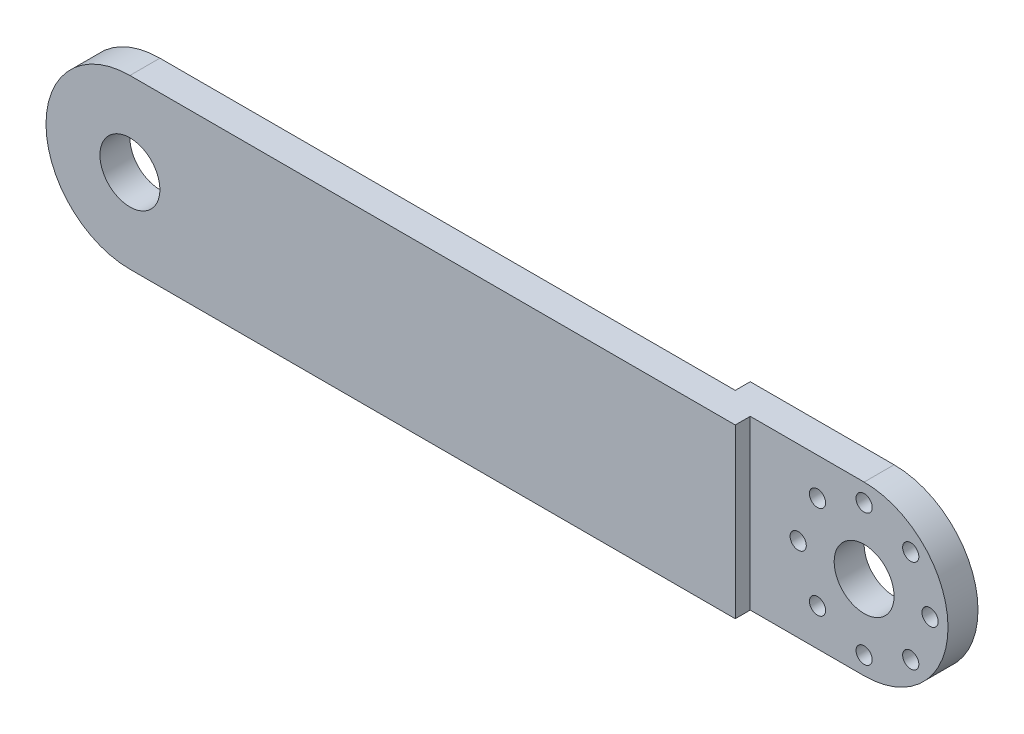
ISO-10303-21;
HEADER;
FILE_DESCRIPTION(('STEP AP214'),'2;1');
FILE_NAME('part.step','',(''),(''),'','','');
FILE_SCHEMA(('AUTOMOTIVE_DESIGN { 1 0 10303 214 1 1 1 1 }'));
ENDSEC;
DATA;
#1=APPLICATION_CONTEXT('core data for automotive mechanical design processes');
#2=APPLICATION_PROTOCOL_DEFINITION('international standard','automotive_design',2000,#1);
#3=PRODUCT_CONTEXT('',#1,'mechanical');
#4=PRODUCT('Part','Part','',(#3));
#5=PRODUCT_RELATED_PRODUCT_CATEGORY('part','',(#4));
#6=PRODUCT_DEFINITION_FORMATION('','',#4);
#7=PRODUCT_DEFINITION_CONTEXT('part definition',#1,'design');
#8=PRODUCT_DEFINITION('design','',#6,#7);
#9=PRODUCT_DEFINITION_SHAPE('','',#8);
#10=(LENGTH_UNIT() NAMED_UNIT(*) SI_UNIT(.MILLI.,.METRE.));
#11=(NAMED_UNIT(*) PLANE_ANGLE_UNIT() SI_UNIT($,.RADIAN.));
#12=(NAMED_UNIT(*) SI_UNIT($,.STERADIAN.) SOLID_ANGLE_UNIT());
#13=UNCERTAINTY_MEASURE_WITH_UNIT(LENGTH_MEASURE(1.E-05),#10,'distance_accuracy_value','');
#14=(GEOMETRIC_REPRESENTATION_CONTEXT(3) GLOBAL_UNCERTAINTY_ASSIGNED_CONTEXT((#13)) GLOBAL_UNIT_ASSIGNED_CONTEXT((#10,
#11,#12)) REPRESENTATION_CONTEXT('',''));
#15=CARTESIAN_POINT('',(0.,0.,0.));
#16=DIRECTION('',(0.,0.,1.));
#17=DIRECTION('',(1.,0.,0.));
#18=AXIS2_PLACEMENT_3D('',#15,#16,#17);
#19=CARTESIAN_POINT('',(0.,-14.,5.));
#20=DIRECTION('',(0.,1.,0.));
#21=DIRECTION('',(0.,0.,1.));
#22=AXIS2_PLACEMENT_3D('',#19,#20,#21);
#23=PLANE('',#22);
#24=DIRECTION('',(1.,0.,0.));
#25=VECTOR('',#24,1.);
#26=CARTESIAN_POINT('',(0.,-14.,0.));
#27=LINE('',#26,#25);
#28=CARTESIAN_POINT('',(0.,-14.,0.));
#29=VERTEX_POINT('',#28);
#30=CARTESIAN_POINT('',(96.,-14.,0.));
#31=VERTEX_POINT('',#30);
#32=EDGE_CURVE('E70',#29,#31,#27,.T.);
#33=ORIENTED_EDGE('',*,*,#32,.T.);
#34=DIRECTION('',(0.,0.,-1.));
#35=VECTOR('',#34,1.);
#36=CARTESIAN_POINT('',(96.,-14.,-2.5));
#37=LINE('',#36,#35);
#38=CARTESIAN_POINT('',(96.,-14.,-2.5));
#39=VERTEX_POINT('',#38);
#40=EDGE_CURVE('E94',#31,#39,#37,.T.);
#41=ORIENTED_EDGE('',*,*,#40,.T.);
#42=DIRECTION('',(-1.,0.,0.));
#43=VECTOR('',#42,1.);
#44=CARTESIAN_POINT('',(101.,-14.,-2.5));
#45=LINE('',#44,#43);
#46=CARTESIAN_POINT('',(120.,-14.,-2.5));
#47=VERTEX_POINT('',#46);
#48=EDGE_CURVE('E91',#47,#39,#45,.T.);
#49=ORIENTED_EDGE('',*,*,#48,.F.);
#50=DIRECTION('',(0.,0.,-1.));
#51=VECTOR('',#50,1.);
#52=CARTESIAN_POINT('',(120.,-14.,2.5));
#53=LINE('',#52,#51);
#54=CARTESIAN_POINT('',(120.,-14.,2.5));
#55=VERTEX_POINT('',#54);
#56=EDGE_CURVE('E79',#55,#47,#53,.T.);
#57=ORIENTED_EDGE('',*,*,#56,.F.);
#58=DIRECTION('',(-1.,0.,0.));
#59=VECTOR('',#58,1.);
#60=CARTESIAN_POINT('',(106.,-14.,2.5));
#61=LINE('',#60,#59);
#62=CARTESIAN_POINT('',(101.,-14.,2.5));
#63=VERTEX_POINT('',#62);
#64=EDGE_CURVE('E120',#55,#63,#61,.T.);
#65=ORIENTED_EDGE('',*,*,#64,.T.);
#66=DIRECTION('',(0.,0.,1.));
#67=VECTOR('',#66,1.);
#68=CARTESIAN_POINT('',(101.,-14.,2.5));
#69=LINE('',#68,#67);
#70=CARTESIAN_POINT('',(101.,-14.,5.));
#71=VERTEX_POINT('',#70);
#72=EDGE_CURVE('E265',#63,#71,#69,.T.);
#73=ORIENTED_EDGE('',*,*,#72,.T.);
#74=DIRECTION('',(1.,0.,0.));
#75=VECTOR('',#74,1.);
#76=CARTESIAN_POINT('',(0.,-14.,5.));
#77=LINE('',#76,#75);
#78=CARTESIAN_POINT('',(0.,-14.,5.));
#79=VERTEX_POINT('',#78);
#80=EDGE_CURVE('E134',#79,#71,#77,.T.);
#81=ORIENTED_EDGE('',*,*,#80,.F.);
#82=DIRECTION('',(0.,0.,-1.));
#83=VECTOR('',#82,1.);
#84=CARTESIAN_POINT('',(0.,-14.,5.));
#85=LINE('',#84,#83);
#86=EDGE_CURVE('E11',#79,#29,#85,.T.);
#87=ORIENTED_EDGE('',*,*,#86,.T.);
#88=EDGE_LOOP('',(#33,#41,#49,#57,#65,#73,#81,#87));
#89=FACE_BOUND('',#88,.T.);
#90=ADVANCED_FACE('F39',(#89),#23,.F.);
#91=CARTESIAN_POINT('',(0.,14.,5.));
#92=DIRECTION('',(0.,-1.,0.));
#93=DIRECTION('',(0.,0.,-1.));
#94=AXIS2_PLACEMENT_3D('',#91,#92,#93);
#95=PLANE('',#94);
#96=DIRECTION('',(0.,0.,-1.));
#97=VECTOR('',#96,1.);
#98=CARTESIAN_POINT('',(96.,14.,-2.5));
#99=LINE('',#98,#97);
#100=CARTESIAN_POINT('',(96.,14.,0.));
#101=VERTEX_POINT('',#100);
#102=CARTESIAN_POINT('',(96.,14.,-2.5));
#103=VERTEX_POINT('',#102);
#104=EDGE_CURVE('E312',#101,#103,#99,.T.);
#105=ORIENTED_EDGE('',*,*,#104,.F.);
#106=DIRECTION('',(-1.,0.,0.));
#107=VECTOR('',#106,1.);
#108=CARTESIAN_POINT('',(0.,14.,0.));
#109=LINE('',#108,#107);
#110=CARTESIAN_POINT('',(0.,14.,0.));
#111=VERTEX_POINT('',#110);
#112=EDGE_CURVE('E135',#101,#111,#109,.T.);
#113=ORIENTED_EDGE('',*,*,#112,.T.);
#114=DIRECTION('',(0.,0.,-1.));
#115=VECTOR('',#114,1.);
#116=CARTESIAN_POINT('',(0.,14.,5.));
#117=LINE('',#116,#115);
#118=CARTESIAN_POINT('',(0.,14.,5.));
#119=VERTEX_POINT('',#118);
#120=EDGE_CURVE('E49',#119,#111,#117,.T.);
#121=ORIENTED_EDGE('',*,*,#120,.F.);
#122=DIRECTION('',(-1.,0.,0.));
#123=VECTOR('',#122,1.);
#124=CARTESIAN_POINT('',(0.,14.,5.));
#125=LINE('',#124,#123);
#126=CARTESIAN_POINT('',(101.,14.,5.));
#127=VERTEX_POINT('',#126);
#128=EDGE_CURVE('E58',#127,#119,#125,.T.);
#129=ORIENTED_EDGE('',*,*,#128,.F.);
#130=DIRECTION('',(0.,0.,1.));
#131=VECTOR('',#130,1.);
#132=CARTESIAN_POINT('',(101.,14.,2.5));
#133=LINE('',#132,#131);
#134=CARTESIAN_POINT('',(101.,14.,2.5));
#135=VERTEX_POINT('',#134);
#136=EDGE_CURVE('E263',#135,#127,#133,.T.);
#137=ORIENTED_EDGE('',*,*,#136,.F.);
#138=DIRECTION('',(1.,0.,0.));
#139=VECTOR('',#138,1.);
#140=CARTESIAN_POINT('',(106.,14.,2.5));
#141=LINE('',#140,#139);
#142=CARTESIAN_POINT('',(120.,14.,2.5));
#143=VERTEX_POINT('',#142);
#144=EDGE_CURVE('E113',#135,#143,#141,.T.);
#145=ORIENTED_EDGE('',*,*,#144,.T.);
#146=DIRECTION('',(0.,0.,-1.));
#147=VECTOR('',#146,1.);
#148=CARTESIAN_POINT('',(120.,14.,2.5));
#149=LINE('',#148,#147);
#150=CARTESIAN_POINT('',(120.,14.,-2.5));
#151=VERTEX_POINT('',#150);
#152=EDGE_CURVE('E108',#143,#151,#149,.T.);
#153=ORIENTED_EDGE('',*,*,#152,.T.);
#154=DIRECTION('',(1.,0.,0.));
#155=VECTOR('',#154,1.);
#156=CARTESIAN_POINT('',(106.,14.,-2.5));
#157=LINE('',#156,#155);
#158=EDGE_CURVE('E99',#103,#151,#157,.T.);
#159=ORIENTED_EDGE('',*,*,#158,.F.);
#160=EDGE_LOOP('',(#105,#113,#121,#129,#137,#145,#153,#159));
#161=FACE_BOUND('',#160,.T.);
#162=ADVANCED_FACE('F191',(#161),#95,.F.);
#163=CARTESIAN_POINT('',(0.,0.,5.));
#164=DIRECTION('',(0.,0.,1.));
#165=DIRECTION('',(1.,0.,0.));
#166=AXIS2_PLACEMENT_3D('',#163,#164,#165);
#167=PLANE('',#166);
#168=CARTESIAN_POINT('',(0.,0.,5.));
#169=DIRECTION('',(0.,0.,-1.));
#170=DIRECTION('',(-1.,0.,0.));
#171=AXIS2_PLACEMENT_3D('',#168,#169,#170);
#172=CIRCLE('',#171,5.);
#173=CARTESIAN_POINT('',(-5.,0.,5.));
#174=VERTEX_POINT('',#173);
#175=EDGE_CURVE('E126',#174,#174,#172,.T.);
#176=ORIENTED_EDGE('',*,*,#175,.T.);
#177=EDGE_LOOP('',(#176));
#178=FACE_BOUND('',#177,.T.);
#179=ORIENTED_EDGE('',*,*,#80,.T.);
#180=DIRECTION('',(0.,-1.,0.));
#181=VECTOR('',#180,1.);
#182=CARTESIAN_POINT('',(101.,14.,5.));
#183=LINE('',#182,#181);
#184=EDGE_CURVE('E267',#127,#71,#183,.T.);
#185=ORIENTED_EDGE('',*,*,#184,.F.);
#186=ORIENTED_EDGE('',*,*,#128,.T.);
#187=CARTESIAN_POINT('',(0.,0.,5.));
#188=DIRECTION('',(0.,0.,1.));
#189=DIRECTION('',(1.,0.,0.));
#190=AXIS2_PLACEMENT_3D('',#187,#188,#189);
#191=CIRCLE('',#190,14.);
#192=EDGE_CURVE('E132',#119,#79,#191,.T.);
#193=ORIENTED_EDGE('',*,*,#192,.T.);
#194=EDGE_LOOP('',(#179,#185,#186,#193));
#195=FACE_BOUND('',#194,.T.);
#196=ADVANCED_FACE('F196',(#178,#195),#167,.T.);
#197=CARTESIAN_POINT('',(0.,0.,0.));
#198=DIRECTION('',(0.,0.,1.));
#199=DIRECTION('',(1.,0.,0.));
#200=AXIS2_PLACEMENT_3D('',#197,#198,#199);
#201=PLANE('',#200);
#202=CARTESIAN_POINT('',(0.,0.,0.));
#203=DIRECTION('',(0.,0.,-1.));
#204=DIRECTION('',(-1.,0.,0.));
#205=AXIS2_PLACEMENT_3D('',#202,#203,#204);
#206=CIRCLE('',#205,5.);
#207=CARTESIAN_POINT('',(-5.,0.,0.));
#208=VERTEX_POINT('',#207);
#209=EDGE_CURVE('E125',#208,#208,#206,.T.);
#210=ORIENTED_EDGE('',*,*,#209,.F.);
#211=EDGE_LOOP('',(#210));
#212=FACE_BOUND('',#211,.T.);
#213=ORIENTED_EDGE('',*,*,#112,.F.);
#214=DIRECTION('',(0.,-1.,0.));
#215=VECTOR('',#214,1.);
#216=CARTESIAN_POINT('',(96.,14.,0.));
#217=LINE('',#216,#215);
#218=EDGE_CURVE('E275',#101,#31,#217,.T.);
#219=ORIENTED_EDGE('',*,*,#218,.T.);
#220=ORIENTED_EDGE('',*,*,#32,.F.);
#221=CARTESIAN_POINT('',(0.,0.,0.));
#222=DIRECTION('',(0.,0.,1.));
#223=DIRECTION('',(1.,0.,0.));
#224=AXIS2_PLACEMENT_3D('',#221,#222,#223);
#225=CIRCLE('',#224,14.);
#226=EDGE_CURVE('E129',#111,#29,#225,.T.);
#227=ORIENTED_EDGE('',*,*,#226,.F.);
#228=EDGE_LOOP('',(#213,#219,#220,#227));
#229=FACE_BOUND('',#228,.T.);
#230=ADVANCED_FACE('F200',(#212,#229),#201,.F.);
#231=CARTESIAN_POINT('',(0.,0.,5.));
#232=DIRECTION('',(0.,0.,-1.));
#233=DIRECTION('',(-1.,0.,0.));
#234=AXIS2_PLACEMENT_3D('',#231,#232,#233);
#235=CYLINDRICAL_SURFACE('',#234,14.);
#236=ORIENTED_EDGE('',*,*,#226,.T.);
#237=ORIENTED_EDGE('',*,*,#86,.F.);
#238=ORIENTED_EDGE('',*,*,#192,.F.);
#239=ORIENTED_EDGE('',*,*,#120,.T.);
#240=EDGE_LOOP('',(#236,#237,#238,#239));
#241=FACE_BOUND('',#240,.T.);
#242=ADVANCED_FACE('F41',(#241),#235,.T.);
#243=CARTESIAN_POINT('',(0.,0.,5.));
#244=DIRECTION('',(0.,0.,-1.));
#245=DIRECTION('',(-1.,0.,0.));
#246=AXIS2_PLACEMENT_3D('',#243,#244,#245);
#247=CYLINDRICAL_SURFACE('',#246,5.);
#248=ORIENTED_EDGE('',*,*,#175,.F.);
#249=EDGE_LOOP('',(#248));
#250=FACE_BOUND('',#249,.T.);
#251=ORIENTED_EDGE('',*,*,#209,.T.);
#252=EDGE_LOOP('',(#251));
#253=FACE_BOUND('',#252,.T.);
#254=ADVANCED_FACE('F207',(#250,#253),#247,.F.);
#255=CARTESIAN_POINT('',(0.,0.,-2.5));
#256=DIRECTION('',(0.,0.,1.));
#257=DIRECTION('',(1.,0.,0.));
#258=AXIS2_PLACEMENT_3D('',#255,#256,#257);
#259=PLANE('',#258);
#260=CARTESIAN_POINT('',(131.,0.,-2.5));
#261=DIRECTION('',(0.,0.,-1.));
#262=DIRECTION('',(-1.,0.,0.));
#263=AXIS2_PLACEMENT_3D('',#260,#261,#262);
#264=CIRCLE('',#263,1.34999999999998);
#265=CARTESIAN_POINT('',(129.65,0.,-2.5));
#266=VERTEX_POINT('',#265);
#267=EDGE_CURVE('E281',#266,#266,#264,.T.);
#268=ORIENTED_EDGE('',*,*,#267,.F.);
#269=EDGE_LOOP('',(#268));
#270=FACE_BOUND('',#269,.T.);
#271=CARTESIAN_POINT('',(120.,-11.,-2.5));
#272=DIRECTION('',(0.,0.,-1.));
#273=DIRECTION('',(-1.,0.,0.));
#274=AXIS2_PLACEMENT_3D('',#271,#272,#273);
#275=CIRCLE('',#274,1.35000000000001);
#276=CARTESIAN_POINT('',(118.65,-11.,-2.5));
#277=VERTEX_POINT('',#276);
#278=EDGE_CURVE('E290',#277,#277,#275,.T.);
#279=ORIENTED_EDGE('',*,*,#278,.F.);
#280=EDGE_LOOP('',(#279));
#281=FACE_BOUND('',#280,.T.);
#282=CARTESIAN_POINT('',(109.,0.,-2.5));
#283=DIRECTION('',(0.,0.,-1.));
#284=DIRECTION('',(-1.,0.,0.));
#285=AXIS2_PLACEMENT_3D('',#282,#283,#284);
#286=CIRCLE('',#285,1.35000000000001);
#287=CARTESIAN_POINT('',(107.65,0.,-2.5));
#288=VERTEX_POINT('',#287);
#289=EDGE_CURVE('E292',#288,#288,#286,.T.);
#290=ORIENTED_EDGE('',*,*,#289,.F.);
#291=EDGE_LOOP('',(#290));
#292=FACE_BOUND('',#291,.T.);
#293=CARTESIAN_POINT('',(120.,11.,-2.5));
#294=DIRECTION('',(0.,0.,-1.));
#295=DIRECTION('',(-1.,0.,0.));
#296=AXIS2_PLACEMENT_3D('',#293,#294,#295);
#297=CIRCLE('',#296,1.35000000000001);
#298=CARTESIAN_POINT('',(118.65,11.,-2.5));
#299=VERTEX_POINT('',#298);
#300=EDGE_CURVE('E236',#299,#299,#297,.T.);
#301=ORIENTED_EDGE('',*,*,#300,.F.);
#302=EDGE_LOOP('',(#301));
#303=FACE_BOUND('',#302,.T.);
#304=CARTESIAN_POINT('',(112.221825406948,7.77817459305201,-2.5));
#305=DIRECTION('',(0.,0.,-1.));
#306=DIRECTION('',(-1.,0.,0.));
#307=AXIS2_PLACEMENT_3D('',#304,#305,#306);
#308=CIRCLE('',#307,1.35000000000001);
#309=CARTESIAN_POINT('',(110.871825406948,7.77817459305201,-2.5));
#310=VERTEX_POINT('',#309);
#311=EDGE_CURVE('E278',#310,#310,#308,.T.);
#312=ORIENTED_EDGE('',*,*,#311,.F.);
#313=EDGE_LOOP('',(#312));
#314=FACE_BOUND('',#313,.T.);
#315=CARTESIAN_POINT('',(112.221825406948,-7.77817459305183,-2.5));
#316=DIRECTION('',(0.,0.,-1.));
#317=DIRECTION('',(-1.,0.,0.));
#318=AXIS2_PLACEMENT_3D('',#315,#316,#317);
#319=CIRCLE('',#318,1.35000000000001);
#320=CARTESIAN_POINT('',(110.871825406948,-7.77817459305183,-2.5));
#321=VERTEX_POINT('',#320);
#322=EDGE_CURVE('E282',#321,#321,#319,.T.);
#323=ORIENTED_EDGE('',*,*,#322,.F.);
#324=EDGE_LOOP('',(#323));
#325=FACE_BOUND('',#324,.T.);
#326=CARTESIAN_POINT('',(127.778174593052,-7.77817459305202,-2.5));
#327=DIRECTION('',(0.,0.,-1.));
#328=DIRECTION('',(-1.,0.,0.));
#329=AXIS2_PLACEMENT_3D('',#326,#327,#328);
#330=CIRCLE('',#329,1.34999999999998);
#331=CARTESIAN_POINT('',(126.428174593052,-7.77817459305202,-2.5));
#332=VERTEX_POINT('',#331);
#333=EDGE_CURVE('E285',#332,#332,#330,.T.);
#334=ORIENTED_EDGE('',*,*,#333,.F.);
#335=EDGE_LOOP('',(#334));
#336=FACE_BOUND('',#335,.T.);
#337=CARTESIAN_POINT('',(127.778174593052,7.77817459305201,-2.5));
#338=DIRECTION('',(0.,0.,-1.));
#339=DIRECTION('',(-1.,0.,0.));
#340=AXIS2_PLACEMENT_3D('',#337,#338,#339);
#341=CIRCLE('',#340,1.34999999999998);
#342=CARTESIAN_POINT('',(126.428174593052,7.77817459305201,-2.5));
#343=VERTEX_POINT('',#342);
#344=EDGE_CURVE('E266',#343,#343,#341,.T.);
#345=ORIENTED_EDGE('',*,*,#344,.F.);
#346=EDGE_LOOP('',(#345));
#347=FACE_BOUND('',#346,.T.);
#348=CARTESIAN_POINT('',(120.,0.,-2.5));
#349=DIRECTION('',(0.,0.,-1.));
#350=DIRECTION('',(-1.,0.,0.));
#351=AXIS2_PLACEMENT_3D('',#348,#349,#350);
#352=CIRCLE('',#351,5.);
#353=CARTESIAN_POINT('',(115.,0.,-2.5));
#354=VERTEX_POINT('',#353);
#355=EDGE_CURVE('E149',#354,#354,#352,.T.);
#356=ORIENTED_EDGE('',*,*,#355,.F.);
#357=EDGE_LOOP('',(#356));
#358=FACE_BOUND('',#357,.T.);
#359=ORIENTED_EDGE('',*,*,#158,.T.);
#360=CARTESIAN_POINT('',(120.,0.,-2.5));
#361=DIRECTION('',(0.,0.,-1.));
#362=DIRECTION('',(-1.,0.,0.));
#363=AXIS2_PLACEMENT_3D('',#360,#361,#362);
#364=CIRCLE('',#363,14.);
#365=EDGE_CURVE('E104',#151,#47,#364,.T.);
#366=ORIENTED_EDGE('',*,*,#365,.T.);
#367=ORIENTED_EDGE('',*,*,#48,.T.);
#368=DIRECTION('',(0.,-1.,0.));
#369=VECTOR('',#368,1.);
#370=CARTESIAN_POINT('',(96.,14.,-2.5));
#371=LINE('',#370,#369);
#372=EDGE_CURVE('E272',#103,#39,#371,.T.);
#373=ORIENTED_EDGE('',*,*,#372,.F.);
#374=EDGE_LOOP('',(#359,#366,#367,#373));
#375=FACE_BOUND('',#374,.T.);
#376=ADVANCED_FACE('F110',(#270,#281,#292,#303,#314,#325,#336,#347,#358,#375),#259,.F.);
#377=CARTESIAN_POINT('',(120.,0.,2.5));
#378=DIRECTION('',(0.,0.,-1.));
#379=DIRECTION('',(-1.,0.,0.));
#380=AXIS2_PLACEMENT_3D('',#377,#378,#379);
#381=CYLINDRICAL_SURFACE('',#380,14.);
#382=ORIENTED_EDGE('',*,*,#365,.F.);
#383=ORIENTED_EDGE('',*,*,#152,.F.);
#384=CARTESIAN_POINT('',(120.,0.,2.5));
#385=DIRECTION('',(0.,0.,-1.));
#386=DIRECTION('',(-1.,0.,0.));
#387=AXIS2_PLACEMENT_3D('',#384,#385,#386);
#388=CIRCLE('',#387,14.);
#389=EDGE_CURVE('E106',#143,#55,#388,.T.);
#390=ORIENTED_EDGE('',*,*,#389,.T.);
#391=ORIENTED_EDGE('',*,*,#56,.T.);
#392=EDGE_LOOP('',(#382,#383,#390,#391));
#393=FACE_BOUND('',#392,.T.);
#394=ADVANCED_FACE('F103',(#393),#381,.T.);
#395=CARTESIAN_POINT('',(120.,0.,2.5));
#396=DIRECTION('',(0.,0.,-1.));
#397=DIRECTION('',(-1.,0.,0.));
#398=AXIS2_PLACEMENT_3D('',#395,#396,#397);
#399=PLANE('',#398);
#400=CARTESIAN_POINT('',(131.,0.,2.5));
#401=DIRECTION('',(0.,0.,-1.));
#402=DIRECTION('',(-1.,0.,0.));
#403=AXIS2_PLACEMENT_3D('',#400,#401,#402);
#404=CIRCLE('',#403,1.34999999999998);
#405=CARTESIAN_POINT('',(129.65,0.,2.5));
#406=VERTEX_POINT('',#405);
#407=EDGE_CURVE('E43',#406,#406,#404,.T.);
#408=ORIENTED_EDGE('',*,*,#407,.T.);
#409=EDGE_LOOP('',(#408));
#410=FACE_BOUND('',#409,.T.);
#411=CARTESIAN_POINT('',(120.,-11.,2.5));
#412=DIRECTION('',(0.,0.,-1.));
#413=DIRECTION('',(-1.,0.,0.));
#414=AXIS2_PLACEMENT_3D('',#411,#412,#413);
#415=CIRCLE('',#414,1.35000000000001);
#416=CARTESIAN_POINT('',(118.65,-11.,2.5));
#417=VERTEX_POINT('',#416);
#418=EDGE_CURVE('E118',#417,#417,#415,.T.);
#419=ORIENTED_EDGE('',*,*,#418,.T.);
#420=EDGE_LOOP('',(#419));
#421=FACE_BOUND('',#420,.T.);
#422=CARTESIAN_POINT('',(109.,0.,2.5));
#423=DIRECTION('',(0.,0.,-1.));
#424=DIRECTION('',(-1.,0.,0.));
#425=AXIS2_PLACEMENT_3D('',#422,#423,#424);
#426=CIRCLE('',#425,1.35000000000001);
#427=CARTESIAN_POINT('',(107.65,0.,2.5));
#428=VERTEX_POINT('',#427);
#429=EDGE_CURVE('E164',#428,#428,#426,.T.);
#430=ORIENTED_EDGE('',*,*,#429,.T.);
#431=EDGE_LOOP('',(#430));
#432=FACE_BOUND('',#431,.T.);
#433=CARTESIAN_POINT('',(120.,11.,2.5));
#434=DIRECTION('',(0.,0.,-1.));
#435=DIRECTION('',(-1.,0.,0.));
#436=AXIS2_PLACEMENT_3D('',#433,#434,#435);
#437=CIRCLE('',#436,1.35000000000001);
#438=CARTESIAN_POINT('',(118.65,11.,2.5));
#439=VERTEX_POINT('',#438);
#440=EDGE_CURVE('E161',#439,#439,#437,.T.);
#441=ORIENTED_EDGE('',*,*,#440,.T.);
#442=EDGE_LOOP('',(#441));
#443=FACE_BOUND('',#442,.T.);
#444=CARTESIAN_POINT('',(112.221825406948,7.77817459305201,2.5));
#445=DIRECTION('',(0.,0.,-1.));
#446=DIRECTION('',(-1.,0.,0.));
#447=AXIS2_PLACEMENT_3D('',#444,#445,#446);
#448=CIRCLE('',#447,1.35000000000001);
#449=CARTESIAN_POINT('',(110.871825406948,7.77817459305201,2.5));
#450=VERTEX_POINT('',#449);
#451=EDGE_CURVE('E158',#450,#450,#448,.T.);
#452=ORIENTED_EDGE('',*,*,#451,.T.);
#453=EDGE_LOOP('',(#452));
#454=FACE_BOUND('',#453,.T.);
#455=CARTESIAN_POINT('',(112.221825406948,-7.77817459305183,2.5));
#456=DIRECTION('',(0.,0.,-1.));
#457=DIRECTION('',(-1.,0.,0.));
#458=AXIS2_PLACEMENT_3D('',#455,#456,#457);
#459=CIRCLE('',#458,1.35000000000001);
#460=CARTESIAN_POINT('',(110.871825406948,-7.77817459305183,2.5));
#461=VERTEX_POINT('',#460);
#462=EDGE_CURVE('E155',#461,#461,#459,.T.);
#463=ORIENTED_EDGE('',*,*,#462,.T.);
#464=EDGE_LOOP('',(#463));
#465=FACE_BOUND('',#464,.T.);
#466=CARTESIAN_POINT('',(127.778174593052,-7.77817459305202,2.5));
#467=DIRECTION('',(0.,0.,-1.));
#468=DIRECTION('',(-1.,0.,0.));
#469=AXIS2_PLACEMENT_3D('',#466,#467,#468);
#470=CIRCLE('',#469,1.34999999999998);
#471=CARTESIAN_POINT('',(126.428174593052,-7.77817459305202,2.5));
#472=VERTEX_POINT('',#471);
#473=EDGE_CURVE('E152',#472,#472,#470,.T.);
#474=ORIENTED_EDGE('',*,*,#473,.T.);
#475=EDGE_LOOP('',(#474));
#476=FACE_BOUND('',#475,.T.);
#477=CARTESIAN_POINT('',(127.778174593052,7.77817459305201,2.5));
#478=DIRECTION('',(0.,0.,-1.));
#479=DIRECTION('',(-1.,0.,0.));
#480=AXIS2_PLACEMENT_3D('',#477,#478,#479);
#481=CIRCLE('',#480,1.34999999999998);
#482=CARTESIAN_POINT('',(126.428174593052,7.77817459305201,2.5));
#483=VERTEX_POINT('',#482);
#484=EDGE_CURVE('E148',#483,#483,#481,.T.);
#485=ORIENTED_EDGE('',*,*,#484,.T.);
#486=EDGE_LOOP('',(#485));
#487=FACE_BOUND('',#486,.T.);
#488=CARTESIAN_POINT('',(120.,0.,2.5));
#489=DIRECTION('',(0.,0.,-1.));
#490=DIRECTION('',(-1.,0.,0.));
#491=AXIS2_PLACEMENT_3D('',#488,#489,#490);
#492=CIRCLE('',#491,5.);
#493=CARTESIAN_POINT('',(115.,0.,2.5));
#494=VERTEX_POINT('',#493);
#495=EDGE_CURVE('E145',#494,#494,#492,.T.);
#496=ORIENTED_EDGE('',*,*,#495,.T.);
#497=EDGE_LOOP('',(#496));
#498=FACE_BOUND('',#497,.T.);
#499=ORIENTED_EDGE('',*,*,#144,.F.);
#500=DIRECTION('',(0.,-1.,0.));
#501=VECTOR('',#500,1.);
#502=CARTESIAN_POINT('',(101.,14.,2.5));
#503=LINE('',#502,#501);
#504=EDGE_CURVE('E255',#135,#63,#503,.T.);
#505=ORIENTED_EDGE('',*,*,#504,.T.);
#506=ORIENTED_EDGE('',*,*,#64,.F.);
#507=ORIENTED_EDGE('',*,*,#389,.F.);
#508=EDGE_LOOP('',(#499,#505,#506,#507));
#509=FACE_BOUND('',#508,.T.);
#510=ADVANCED_FACE('F169',(#410,#421,#432,#443,#454,#465,#476,#487,#498,#509),#399,.F.);
#511=CARTESIAN_POINT('',(120.,0.,5.));
#512=DIRECTION('',(0.,0.,-1.));
#513=DIRECTION('',(-1.,0.,0.));
#514=AXIS2_PLACEMENT_3D('',#511,#512,#513);
#515=CYLINDRICAL_SURFACE('',#514,5.);
#516=ORIENTED_EDGE('',*,*,#355,.T.);
#517=EDGE_LOOP('',(#516));
#518=FACE_BOUND('',#517,.T.);
#519=ORIENTED_EDGE('',*,*,#495,.F.);
#520=EDGE_LOOP('',(#519));
#521=FACE_BOUND('',#520,.T.);
#522=ADVANCED_FACE('F218',(#518,#521),#515,.F.);
#523=CARTESIAN_POINT('',(127.778174593052,7.77817459305201,5.));
#524=DIRECTION('',(0.,0.,-1.));
#525=DIRECTION('',(-1.,0.,0.));
#526=AXIS2_PLACEMENT_3D('',#523,#524,#525);
#527=CYLINDRICAL_SURFACE('',#526,1.34999999999998);
#528=ORIENTED_EDGE('',*,*,#344,.T.);
#529=EDGE_LOOP('',(#528));
#530=FACE_BOUND('',#529,.T.);
#531=ORIENTED_EDGE('',*,*,#484,.F.);
#532=EDGE_LOOP('',(#531));
#533=FACE_BOUND('',#532,.T.);
#534=ADVANCED_FACE('F221',(#530,#533),#527,.F.);
#535=CARTESIAN_POINT('',(127.778174593052,-7.77817459305202,5.));
#536=DIRECTION('',(0.,0.,-1.));
#537=DIRECTION('',(-1.,0.,0.));
#538=AXIS2_PLACEMENT_3D('',#535,#536,#537);
#539=CYLINDRICAL_SURFACE('',#538,1.34999999999998);
#540=ORIENTED_EDGE('',*,*,#333,.T.);
#541=EDGE_LOOP('',(#540));
#542=FACE_BOUND('',#541,.T.);
#543=ORIENTED_EDGE('',*,*,#473,.F.);
#544=EDGE_LOOP('',(#543));
#545=FACE_BOUND('',#544,.T.);
#546=ADVANCED_FACE('F409',(#542,#545),#539,.F.);
#547=CARTESIAN_POINT('',(112.221825406948,-7.77817459305183,5.));
#548=DIRECTION('',(0.,0.,-1.));
#549=DIRECTION('',(-1.,0.,0.));
#550=AXIS2_PLACEMENT_3D('',#547,#548,#549);
#551=CYLINDRICAL_SURFACE('',#550,1.35000000000001);
#552=ORIENTED_EDGE('',*,*,#322,.T.);
#553=EDGE_LOOP('',(#552));
#554=FACE_BOUND('',#553,.T.);
#555=ORIENTED_EDGE('',*,*,#462,.F.);
#556=EDGE_LOOP('',(#555));
#557=FACE_BOUND('',#556,.T.);
#558=ADVANCED_FACE('F230',(#554,#557),#551,.F.);
#559=CARTESIAN_POINT('',(112.221825406948,7.77817459305201,5.));
#560=DIRECTION('',(0.,0.,-1.));
#561=DIRECTION('',(-1.,0.,0.));
#562=AXIS2_PLACEMENT_3D('',#559,#560,#561);
#563=CYLINDRICAL_SURFACE('',#562,1.35000000000001);
#564=ORIENTED_EDGE('',*,*,#311,.T.);
#565=EDGE_LOOP('',(#564));
#566=FACE_BOUND('',#565,.T.);
#567=ORIENTED_EDGE('',*,*,#451,.F.);
#568=EDGE_LOOP('',(#567));
#569=FACE_BOUND('',#568,.T.);
#570=ADVANCED_FACE('F225',(#566,#569),#563,.F.);
#571=CARTESIAN_POINT('',(120.,11.,5.));
#572=DIRECTION('',(0.,0.,-1.));
#573=DIRECTION('',(-1.,0.,0.));
#574=AXIS2_PLACEMENT_3D('',#571,#572,#573);
#575=CYLINDRICAL_SURFACE('',#574,1.35000000000001);
#576=ORIENTED_EDGE('',*,*,#300,.T.);
#577=EDGE_LOOP('',(#576));
#578=FACE_BOUND('',#577,.T.);
#579=ORIENTED_EDGE('',*,*,#440,.F.);
#580=EDGE_LOOP('',(#579));
#581=FACE_BOUND('',#580,.T.);
#582=ADVANCED_FACE('F185',(#578,#581),#575,.F.);
#583=CARTESIAN_POINT('',(109.,0.,5.));
#584=DIRECTION('',(0.,0.,-1.));
#585=DIRECTION('',(-1.,0.,0.));
#586=AXIS2_PLACEMENT_3D('',#583,#584,#585);
#587=CYLINDRICAL_SURFACE('',#586,1.35000000000001);
#588=ORIENTED_EDGE('',*,*,#289,.T.);
#589=EDGE_LOOP('',(#588));
#590=FACE_BOUND('',#589,.T.);
#591=ORIENTED_EDGE('',*,*,#429,.F.);
#592=EDGE_LOOP('',(#591));
#593=FACE_BOUND('',#592,.T.);
#594=ADVANCED_FACE('F175',(#590,#593),#587,.F.);
#595=CARTESIAN_POINT('',(120.,-11.,5.));
#596=DIRECTION('',(0.,0.,-1.));
#597=DIRECTION('',(-1.,0.,0.));
#598=AXIS2_PLACEMENT_3D('',#595,#596,#597);
#599=CYLINDRICAL_SURFACE('',#598,1.35000000000001);
#600=ORIENTED_EDGE('',*,*,#278,.T.);
#601=EDGE_LOOP('',(#600));
#602=FACE_BOUND('',#601,.T.);
#603=ORIENTED_EDGE('',*,*,#418,.F.);
#604=EDGE_LOOP('',(#603));
#605=FACE_BOUND('',#604,.T.);
#606=ADVANCED_FACE('F172',(#602,#605),#599,.F.);
#607=CARTESIAN_POINT('',(131.,0.,5.));
#608=DIRECTION('',(0.,0.,-1.));
#609=DIRECTION('',(-1.,0.,0.));
#610=AXIS2_PLACEMENT_3D('',#607,#608,#609);
#611=CYLINDRICAL_SURFACE('',#610,1.34999999999998);
#612=ORIENTED_EDGE('',*,*,#267,.T.);
#613=EDGE_LOOP('',(#612));
#614=FACE_BOUND('',#613,.T.);
#615=ORIENTED_EDGE('',*,*,#407,.F.);
#616=EDGE_LOOP('',(#615));
#617=FACE_BOUND('',#616,.T.);
#618=ADVANCED_FACE('F174',(#614,#617),#611,.F.);
#619=CARTESIAN_POINT('',(101.,14.,2.5));
#620=DIRECTION('',(1.,0.,0.));
#621=DIRECTION('',(0.,0.,-1.));
#622=AXIS2_PLACEMENT_3D('',#619,#620,#621);
#623=PLANE('',#622);
#624=ORIENTED_EDGE('',*,*,#72,.F.);
#625=ORIENTED_EDGE('',*,*,#504,.F.);
#626=ORIENTED_EDGE('',*,*,#136,.T.);
#627=ORIENTED_EDGE('',*,*,#184,.T.);
#628=EDGE_LOOP('',(#624,#625,#626,#627));
#629=FACE_BOUND('',#628,.T.);
#630=ADVANCED_FACE('F182',(#629),#623,.T.);
#631=CARTESIAN_POINT('',(96.,14.,-2.5));
#632=DIRECTION('',(-1.,0.,0.));
#633=DIRECTION('',(0.,0.,1.));
#634=AXIS2_PLACEMENT_3D('',#631,#632,#633);
#635=PLANE('',#634);
#636=ORIENTED_EDGE('',*,*,#40,.F.);
#637=ORIENTED_EDGE('',*,*,#218,.F.);
#638=ORIENTED_EDGE('',*,*,#104,.T.);
#639=ORIENTED_EDGE('',*,*,#372,.T.);
#640=EDGE_LOOP('',(#636,#637,#638,#639));
#641=FACE_BOUND('',#640,.T.);
#642=ADVANCED_FACE('F311',(#641),#635,.T.);
#643=CLOSED_SHELL('',(#90,#162,#196,#230,#242,#254,#376,#394,#510,#522,#534,#546,#558,#570,#582,
#594,#606,#618,#630,#642));
#644=MANIFOLD_SOLID_BREP('B2',#643);
#645=ADVANCED_BREP_SHAPE_REPRESENTATION('',(#18,#644),#14);
#646=SHAPE_DEFINITION_REPRESENTATION(#9,#645);
ENDSEC;
END-ISO-10303-21;
